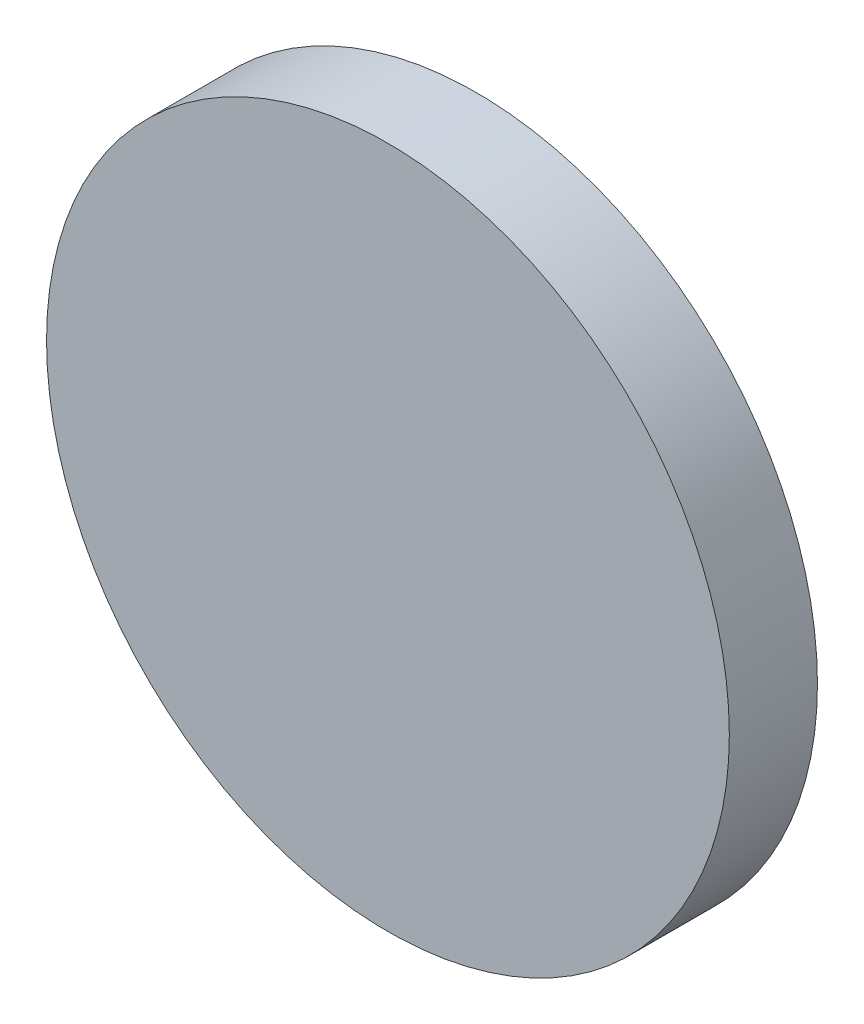
ISO-10303-21;
HEADER;
FILE_DESCRIPTION(('STEP AP214'),'2;1');
FILE_NAME('part.step','',(''),(''),'','','');
FILE_SCHEMA(('AUTOMOTIVE_DESIGN { 1 0 10303 214 1 1 1 1 }'));
ENDSEC;
DATA;
#1=APPLICATION_CONTEXT('core data for automotive mechanical design processes');
#2=APPLICATION_PROTOCOL_DEFINITION('international standard','automotive_design',2000,#1);
#3=PRODUCT_CONTEXT('',#1,'mechanical');
#4=PRODUCT('Part','Part','',(#3));
#5=PRODUCT_RELATED_PRODUCT_CATEGORY('part','',(#4));
#6=PRODUCT_DEFINITION_FORMATION('','',#4);
#7=PRODUCT_DEFINITION_CONTEXT('part definition',#1,'design');
#8=PRODUCT_DEFINITION('design','',#6,#7);
#9=PRODUCT_DEFINITION_SHAPE('','',#8);
#10=(LENGTH_UNIT() NAMED_UNIT(*) SI_UNIT(.MILLI.,.METRE.));
#11=(NAMED_UNIT(*) PLANE_ANGLE_UNIT() SI_UNIT($,.RADIAN.));
#12=(NAMED_UNIT(*) SI_UNIT($,.STERADIAN.) SOLID_ANGLE_UNIT());
#13=UNCERTAINTY_MEASURE_WITH_UNIT(LENGTH_MEASURE(1.E-05),#10,'distance_accuracy_value','');
#14=(GEOMETRIC_REPRESENTATION_CONTEXT(3) GLOBAL_UNCERTAINTY_ASSIGNED_CONTEXT((#13)) GLOBAL_UNIT_ASSIGNED_CONTEXT((#10,
#11,#12)) REPRESENTATION_CONTEXT('',''));
#15=CARTESIAN_POINT('',(0.,0.,0.));
#16=DIRECTION('',(0.,0.,1.));
#17=DIRECTION('',(1.,0.,0.));
#18=AXIS2_PLACEMENT_3D('',#15,#16,#17);
#19=CARTESIAN_POINT('',(4.08114065235497,-9.67656468490911,2.54));
#20=DIRECTION('',(0.,0.,-1.));
#21=DIRECTION('',(-1.,0.,0.));
#22=AXIS2_PLACEMENT_3D('',#19,#20,#21);
#23=CYLINDRICAL_SURFACE('',#22,9.838697239);
#24=CARTESIAN_POINT('',(4.08114065235497,-9.67656468490911,2.54));
#25=DIRECTION('',(0.,0.,1.));
#26=DIRECTION('',(1.,0.,0.));
#27=AXIS2_PLACEMENT_3D('',#24,#25,#26);
#28=CIRCLE('',#27,9.838697239);
#29=CARTESIAN_POINT('',(13.919837891355,-9.67656468490911,2.54));
#30=VERTEX_POINT('',#29);
#31=EDGE_CURVE('E10',#30,#30,#28,.T.);
#32=ORIENTED_EDGE('',*,*,#31,.F.);
#33=EDGE_LOOP('',(#32));
#34=FACE_BOUND('',#33,.T.);
#35=CARTESIAN_POINT('',(4.08114065235497,-9.67656468490911,0.));
#36=DIRECTION('',(0.,0.,1.));
#37=DIRECTION('',(1.,0.,0.));
#38=AXIS2_PLACEMENT_3D('',#35,#36,#37);
#39=CIRCLE('',#38,9.838697239);
#40=CARTESIAN_POINT('',(13.919837891355,-9.67656468490911,0.));
#41=VERTEX_POINT('',#40);
#42=EDGE_CURVE('E33',#41,#41,#39,.T.);
#43=ORIENTED_EDGE('',*,*,#42,.T.);
#44=EDGE_LOOP('',(#43));
#45=FACE_BOUND('',#44,.T.);
#46=ADVANCED_FACE('F30',(#34,#45),#23,.T.);
#47=CARTESIAN_POINT('',(4.08114065235497,-9.67656468490911,2.54));
#48=DIRECTION('',(0.,0.,1.));
#49=DIRECTION('',(1.,0.,0.));
#50=AXIS2_PLACEMENT_3D('',#47,#48,#49);
#51=PLANE('',#50);
#52=ORIENTED_EDGE('',*,*,#31,.T.);
#53=EDGE_LOOP('',(#52));
#54=FACE_BOUND('',#53,.T.);
#55=ADVANCED_FACE('F45',(#54),#51,.T.);
#56=CARTESIAN_POINT('',(4.08114065235497,-9.67656468490911,0.));
#57=DIRECTION('',(0.,0.,1.));
#58=DIRECTION('',(1.,0.,0.));
#59=AXIS2_PLACEMENT_3D('',#56,#57,#58);
#60=PLANE('',#59);
#61=ORIENTED_EDGE('',*,*,#42,.F.);
#62=EDGE_LOOP('',(#61));
#63=FACE_BOUND('',#62,.T.);
#64=ADVANCED_FACE('F43',(#63),#60,.F.);
#65=CLOSED_SHELL('',(#46,#55,#64));
#66=MANIFOLD_SOLID_BREP('B2',#65);
#67=ADVANCED_BREP_SHAPE_REPRESENTATION('',(#18,#66),#14);
#68=SHAPE_DEFINITION_REPRESENTATION(#9,#67);
ENDSEC;
END-ISO-10303-21;
